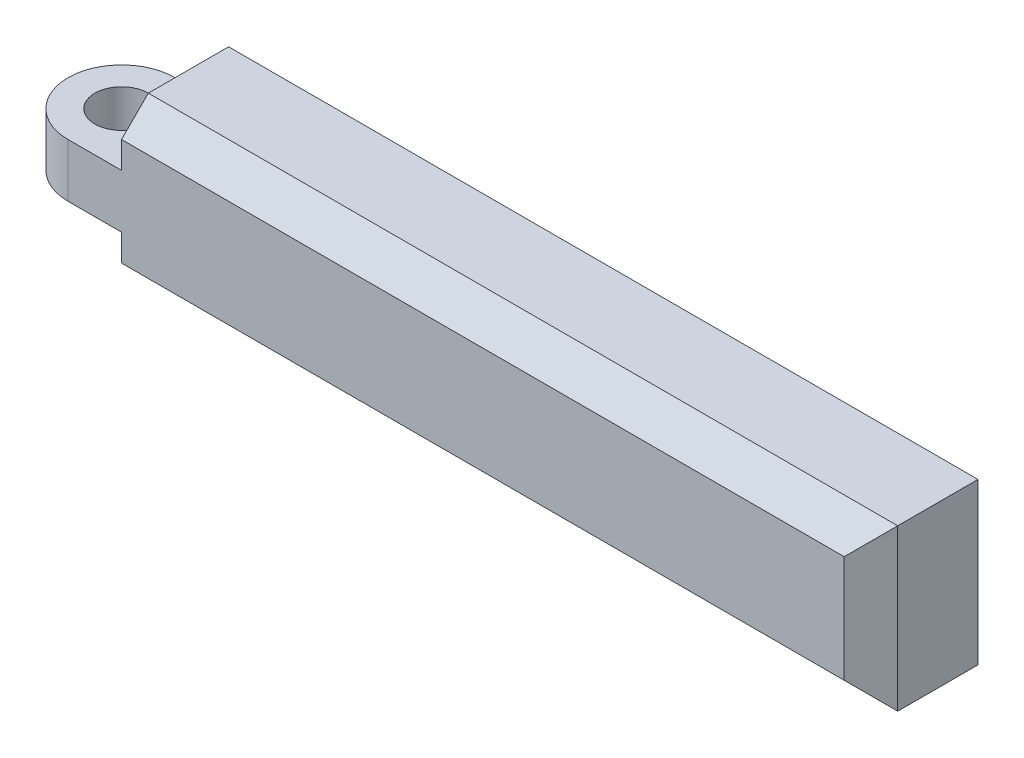
ISO-10303-21;
HEADER;
FILE_DESCRIPTION(('STEP AP214'),'2;1');
FILE_NAME('part.step','',(''),(''),'','','');
FILE_SCHEMA(('AUTOMOTIVE_DESIGN { 1 0 10303 214 1 1 1 1 }'));
ENDSEC;
DATA;
#1=APPLICATION_CONTEXT('core data for automotive mechanical design processes');
#2=APPLICATION_PROTOCOL_DEFINITION('international standard','automotive_design',2000,#1);
#3=PRODUCT_CONTEXT('',#1,'mechanical');
#4=PRODUCT('Part','Part','',(#3));
#5=PRODUCT_RELATED_PRODUCT_CATEGORY('part','',(#4));
#6=PRODUCT_DEFINITION_FORMATION('','',#4);
#7=PRODUCT_DEFINITION_CONTEXT('part definition',#1,'design');
#8=PRODUCT_DEFINITION('design','',#6,#7);
#9=PRODUCT_DEFINITION_SHAPE('','',#8);
#10=(LENGTH_UNIT() NAMED_UNIT(*) SI_UNIT(.MILLI.,.METRE.));
#11=(NAMED_UNIT(*) PLANE_ANGLE_UNIT() SI_UNIT($,.RADIAN.));
#12=(NAMED_UNIT(*) SI_UNIT($,.STERADIAN.) SOLID_ANGLE_UNIT());
#13=UNCERTAINTY_MEASURE_WITH_UNIT(LENGTH_MEASURE(1.E-05),#10,'distance_accuracy_value','');
#14=(GEOMETRIC_REPRESENTATION_CONTEXT(3) GLOBAL_UNCERTAINTY_ASSIGNED_CONTEXT((#13)) GLOBAL_UNIT_ASSIGNED_CONTEXT((#10,
#11,#12)) REPRESENTATION_CONTEXT('',''));
#15=CARTESIAN_POINT('',(0.,0.,0.));
#16=DIRECTION('',(0.,0.,1.));
#17=DIRECTION('',(1.,0.,0.));
#18=AXIS2_PLACEMENT_3D('',#15,#16,#17);
#19=CARTESIAN_POINT('',(-9.,2.,-1.));
#20=DIRECTION('',(0.,-1.,0.));
#21=DIRECTION('',(0.,0.,1.));
#22=AXIS2_PLACEMENT_3D('',#19,#20,#21);
#23=PLANE('',#22);
#24=CARTESIAN_POINT('',(-8.,2.,-2.));
#25=DIRECTION('',(0.,-1.,0.));
#26=DIRECTION('',(0.,0.,-1.));
#27=AXIS2_PLACEMENT_3D('',#24,#25,#26);
#28=CIRCLE('',#27,0.5);
#29=CARTESIAN_POINT('',(-8.,2.,-2.5));
#30=VERTEX_POINT('',#29);
#31=EDGE_CURVE('E156',#30,#30,#28,.T.);
#32=ORIENTED_EDGE('',*,*,#31,.T.);
#33=EDGE_LOOP('',(#32));
#34=FACE_BOUND('',#33,.T.);
#35=CARTESIAN_POINT('',(-8.,2.,-2.));
#36=DIRECTION('',(0.,-1.,0.));
#37=DIRECTION('',(0.,0.,-1.));
#38=AXIS2_PLACEMENT_3D('',#35,#36,#37);
#39=CIRCLE('',#38,1.);
#40=CARTESIAN_POINT('',(-8.,2.,-1.));
#41=VERTEX_POINT('',#40);
#42=CARTESIAN_POINT('',(-8.,2.,-3.));
#43=VERTEX_POINT('',#42);
#44=EDGE_CURVE('E147',#41,#43,#39,.T.);
#45=ORIENTED_EDGE('',*,*,#44,.F.);
#46=DIRECTION('',(1.,0.,0.));
#47=VECTOR('',#46,1.);
#48=CARTESIAN_POINT('',(-9.,2.,-1.));
#49=LINE('',#48,#47);
#50=CARTESIAN_POINT('',(-7.,2.,-1.));
#51=VERTEX_POINT('',#50);
#52=EDGE_CURVE('E150',#41,#51,#49,.T.);
#53=ORIENTED_EDGE('',*,*,#52,.T.);
#54=DIRECTION('',(0.,0.,1.));
#55=VECTOR('',#54,1.);
#56=CARTESIAN_POINT('',(-7.,2.,-1.));
#57=LINE('',#56,#55);
#58=CARTESIAN_POINT('',(-7.,2.,-3.));
#59=VERTEX_POINT('',#58);
#60=EDGE_CURVE('E148',#59,#51,#57,.T.);
#61=ORIENTED_EDGE('',*,*,#60,.F.);
#62=DIRECTION('',(1.,0.,0.));
#63=VECTOR('',#62,1.);
#64=CARTESIAN_POINT('',(-9.,2.,-3.));
#65=LINE('',#64,#63);
#66=EDGE_CURVE('E136',#43,#59,#65,.T.);
#67=ORIENTED_EDGE('',*,*,#66,.F.);
#68=EDGE_LOOP('',(#45,#53,#61,#67));
#69=FACE_BOUND('',#68,.T.);
#70=ADVANCED_FACE('F58',(#34,#69),#23,.F.);
#71=CARTESIAN_POINT('',(-9.,1.,-1.));
#72=DIRECTION('',(0.,1.,0.));
#73=DIRECTION('',(0.,0.,-1.));
#74=AXIS2_PLACEMENT_3D('',#71,#72,#73);
#75=PLANE('',#74);
#76=CARTESIAN_POINT('',(-8.,1.,-2.));
#77=DIRECTION('',(0.,-1.,0.));
#78=DIRECTION('',(0.,0.,-1.));
#79=AXIS2_PLACEMENT_3D('',#76,#77,#78);
#80=CIRCLE('',#79,0.5);
#81=CARTESIAN_POINT('',(-8.,1.,-2.5));
#82=VERTEX_POINT('',#81);
#83=EDGE_CURVE('E163',#82,#82,#80,.T.);
#84=ORIENTED_EDGE('',*,*,#83,.F.);
#85=EDGE_LOOP('',(#84));
#86=FACE_BOUND('',#85,.T.);
#87=DIRECTION('',(1.,0.,0.));
#88=VECTOR('',#87,1.);
#89=CARTESIAN_POINT('',(-9.,1.,-3.));
#90=LINE('',#89,#88);
#91=CARTESIAN_POINT('',(-8.,1.,-3.));
#92=VERTEX_POINT('',#91);
#93=CARTESIAN_POINT('',(-7.,1.,-3.));
#94=VERTEX_POINT('',#93);
#95=EDGE_CURVE('E139',#92,#94,#90,.T.);
#96=ORIENTED_EDGE('',*,*,#95,.T.);
#97=DIRECTION('',(0.,0.,-1.));
#98=VECTOR('',#97,1.);
#99=CARTESIAN_POINT('',(-7.,1.,-1.));
#100=LINE('',#99,#98);
#101=CARTESIAN_POINT('',(-7.,1.,-1.));
#102=VERTEX_POINT('',#101);
#103=EDGE_CURVE('E165',#102,#94,#100,.T.);
#104=ORIENTED_EDGE('',*,*,#103,.F.);
#105=DIRECTION('',(1.,0.,0.));
#106=VECTOR('',#105,1.);
#107=CARTESIAN_POINT('',(-9.,1.,-1.));
#108=LINE('',#107,#106);
#109=CARTESIAN_POINT('',(-8.,1.,-1.));
#110=VERTEX_POINT('',#109);
#111=EDGE_CURVE('E168',#110,#102,#108,.T.);
#112=ORIENTED_EDGE('',*,*,#111,.F.);
#113=CARTESIAN_POINT('',(-8.,1.,-2.));
#114=DIRECTION('',(0.,-1.,0.));
#115=DIRECTION('',(0.,0.,-1.));
#116=AXIS2_PLACEMENT_3D('',#113,#114,#115);
#117=CIRCLE('',#116,1.);
#118=EDGE_CURVE('E161',#110,#92,#117,.T.);
#119=ORIENTED_EDGE('',*,*,#118,.T.);
#120=EDGE_LOOP('',(#96,#104,#112,#119));
#121=FACE_BOUND('',#120,.T.);
#122=ADVANCED_FACE('F223',(#86,#121),#75,.F.);
#123=CARTESIAN_POINT('',(-7.,3.,-3.));
#124=DIRECTION('',(0.,0.,1.));
#125=DIRECTION('',(-1.,0.,0.));
#126=AXIS2_PLACEMENT_3D('',#123,#124,#125);
#127=PLANE('',#126);
#128=DIRECTION('',(0.,1.,0.));
#129=VECTOR('',#128,1.);
#130=CARTESIAN_POINT('',(-8.,0.,-3.));
#131=LINE('',#130,#129);
#132=EDGE_CURVE('E12',#92,#43,#131,.T.);
#133=ORIENTED_EDGE('',*,*,#132,.T.);
#134=ORIENTED_EDGE('',*,*,#66,.T.);
#135=DIRECTION('',(0.,-1.,0.));
#136=VECTOR('',#135,1.);
#137=CARTESIAN_POINT('',(-7.,3.,-3.));
#138=LINE('',#137,#136);
#139=CARTESIAN_POINT('',(-7.,3.,-3.));
#140=VERTEX_POINT('',#139);
#141=EDGE_CURVE('E81',#140,#59,#138,.T.);
#142=ORIENTED_EDGE('',*,*,#141,.F.);
#143=DIRECTION('',(1.,0.,0.));
#144=VECTOR('',#143,1.);
#145=CARTESIAN_POINT('',(-7.,3.,-3.));
#146=LINE('',#145,#144);
#147=CARTESIAN_POINT('',(7.,3.,-3.));
#148=VERTEX_POINT('',#147);
#149=EDGE_CURVE('E178',#140,#148,#146,.T.);
#150=ORIENTED_EDGE('',*,*,#149,.T.);
#151=DIRECTION('',(0.,-1.,0.));
#152=VECTOR('',#151,1.);
#153=CARTESIAN_POINT('',(7.,3.,-3.));
#154=LINE('',#153,#152);
#155=CARTESIAN_POINT('',(7.,0.,-3.));
#156=VERTEX_POINT('',#155);
#157=EDGE_CURVE('E181',#148,#156,#154,.T.);
#158=ORIENTED_EDGE('',*,*,#157,.T.);
#159=DIRECTION('',(1.,0.,0.));
#160=VECTOR('',#159,1.);
#161=CARTESIAN_POINT('',(-7.,0.,-3.));
#162=LINE('',#161,#160);
#163=CARTESIAN_POINT('',(-7.,0.,-3.));
#164=VERTEX_POINT('',#163);
#165=EDGE_CURVE('E176',#164,#156,#162,.T.);
#166=ORIENTED_EDGE('',*,*,#165,.F.);
#167=EDGE_CURVE('E73',#94,#164,#138,.T.);
#168=ORIENTED_EDGE('',*,*,#167,.F.);
#169=ORIENTED_EDGE('',*,*,#95,.F.);
#170=EDGE_LOOP('',(#133,#134,#142,#150,#158,#166,#168,#169));
#171=FACE_BOUND('',#170,.T.);
#172=ADVANCED_FACE('F135',(#171),#127,.F.);
#173=CARTESIAN_POINT('',(-7.,3.,-1.));
#174=DIRECTION('',(1.,0.,0.));
#175=DIRECTION('',(0.,0.,1.));
#176=AXIS2_PLACEMENT_3D('',#173,#174,#175);
#177=PLANE('',#176);
#178=ORIENTED_EDGE('',*,*,#103,.T.);
#179=ORIENTED_EDGE('',*,*,#167,.T.);
#180=DIRECTION('',(0.,0.,-1.));
#181=VECTOR('',#180,1.);
#182=CARTESIAN_POINT('',(-7.,0.,-1.));
#183=LINE('',#182,#181);
#184=CARTESIAN_POINT('',(-7.,0.,-1.5));
#185=VERTEX_POINT('',#184);
#186=EDGE_CURVE('E185',#185,#164,#183,.T.);
#187=ORIENTED_EDGE('',*,*,#186,.F.);
#188=DIRECTION('',(0.,0.707106781186549,0.707106781186546));
#189=VECTOR('',#188,1.);
#190=CARTESIAN_POINT('',(-7.,0.5,-1.));
#191=LINE('',#190,#189);
#192=CARTESIAN_POINT('',(-7.,0.5,-1.));
#193=VERTEX_POINT('',#192);
#194=EDGE_CURVE('E207',#193,#185,#191,.F.);
#195=ORIENTED_EDGE('',*,*,#194,.F.);
#196=DIRECTION('',(0.,-1.,0.));
#197=VECTOR('',#196,1.);
#198=CARTESIAN_POINT('',(-7.,3.,-1.));
#199=LINE('',#198,#197);
#200=EDGE_CURVE('E193',#102,#193,#199,.T.);
#201=ORIENTED_EDGE('',*,*,#200,.F.);
#202=EDGE_LOOP('',(#178,#179,#187,#195,#201));
#203=FACE_BOUND('',#202,.T.);
#204=ADVANCED_FACE('F240',(#203),#177,.F.);
#205=ORIENTED_EDGE('',*,*,#60,.T.);
#206=CARTESIAN_POINT('',(-7.,2.5,-1.));
#207=VERTEX_POINT('',#206);
#208=EDGE_CURVE('E194',#207,#51,#199,.T.);
#209=ORIENTED_EDGE('',*,*,#208,.F.);
#210=DIRECTION('',(0.,-0.707106781186549,0.707106781186546));
#211=VECTOR('',#210,1.);
#212=CARTESIAN_POINT('',(-7.,3.,-1.5));
#213=LINE('',#212,#211);
#214=CARTESIAN_POINT('',(-7.,3.,-1.5));
#215=VERTEX_POINT('',#214);
#216=EDGE_CURVE('E204',#215,#207,#213,.T.);
#217=ORIENTED_EDGE('',*,*,#216,.F.);
#218=DIRECTION('',(0.,0.,-1.));
#219=VECTOR('',#218,1.);
#220=CARTESIAN_POINT('',(-7.,3.,-1.));
#221=LINE('',#220,#219);
#222=EDGE_CURVE('E175',#215,#140,#221,.T.);
#223=ORIENTED_EDGE('',*,*,#222,.T.);
#224=ORIENTED_EDGE('',*,*,#141,.T.);
#225=EDGE_LOOP('',(#205,#209,#217,#223,#224));
#226=FACE_BOUND('',#225,.T.);
#227=ADVANCED_FACE('F237',(#226),#177,.F.);
#228=CARTESIAN_POINT('',(7.,3.,-1.));
#229=DIRECTION('',(-1.,0.,0.));
#230=DIRECTION('',(0.,0.,-1.));
#231=AXIS2_PLACEMENT_3D('',#228,#229,#230);
#232=PLANE('',#231);
#233=DIRECTION('',(0.,0.,1.));
#234=VECTOR('',#233,1.);
#235=CARTESIAN_POINT('',(7.,0.,-1.));
#236=LINE('',#235,#234);
#237=CARTESIAN_POINT('',(7.,0.,-1.5));
#238=VERTEX_POINT('',#237);
#239=EDGE_CURVE('E182',#156,#238,#236,.T.);
#240=ORIENTED_EDGE('',*,*,#239,.F.);
#241=ORIENTED_EDGE('',*,*,#157,.F.);
#242=DIRECTION('',(0.,0.,1.));
#243=VECTOR('',#242,1.);
#244=CARTESIAN_POINT('',(7.,3.,-1.));
#245=LINE('',#244,#243);
#246=CARTESIAN_POINT('',(7.,3.,-1.5));
#247=VERTEX_POINT('',#246);
#248=EDGE_CURVE('E172',#148,#247,#245,.T.);
#249=ORIENTED_EDGE('',*,*,#248,.T.);
#250=DIRECTION('',(0.,1.,0.));
#251=VECTOR('',#250,1.);
#252=CARTESIAN_POINT('',(7.,3.,-1.5));
#253=LINE('',#252,#251);
#254=EDGE_CURVE('E213',#238,#247,#253,.T.);
#255=ORIENTED_EDGE('',*,*,#254,.F.);
#256=EDGE_LOOP('',(#240,#241,#249,#255));
#257=FACE_BOUND('',#256,.T.);
#258=ADVANCED_FACE('F239',(#257),#232,.F.);
#259=CARTESIAN_POINT('',(-7.,3.,-1.));
#260=DIRECTION('',(0.,0.,-1.));
#261=DIRECTION('',(1.,0.,0.));
#262=AXIS2_PLACEMENT_3D('',#259,#260,#261);
#263=PLANE('',#262);
#264=ORIENTED_EDGE('',*,*,#111,.T.);
#265=ORIENTED_EDGE('',*,*,#200,.T.);
#266=DIRECTION('',(-1.,0.,0.));
#267=VECTOR('',#266,1.);
#268=CARTESIAN_POINT('',(-7.,0.5,-1.));
#269=LINE('',#268,#267);
#270=CARTESIAN_POINT('',(6.5,0.5,-1.));
#271=VERTEX_POINT('',#270);
#272=EDGE_CURVE('E202',#271,#193,#269,.T.);
#273=ORIENTED_EDGE('',*,*,#272,.F.);
#274=DIRECTION('',(0.,-1.,0.));
#275=VECTOR('',#274,1.);
#276=CARTESIAN_POINT('',(6.5,3.,-1.));
#277=LINE('',#276,#275);
#278=CARTESIAN_POINT('',(6.5,2.5,-1.));
#279=VERTEX_POINT('',#278);
#280=EDGE_CURVE('E199',#279,#271,#277,.T.);
#281=ORIENTED_EDGE('',*,*,#280,.F.);
#282=DIRECTION('',(1.,0.,0.));
#283=VECTOR('',#282,1.);
#284=CARTESIAN_POINT('',(7.,2.5,-1.));
#285=LINE('',#284,#283);
#286=EDGE_CURVE('E196',#207,#279,#285,.T.);
#287=ORIENTED_EDGE('',*,*,#286,.F.);
#288=ORIENTED_EDGE('',*,*,#208,.T.);
#289=ORIENTED_EDGE('',*,*,#52,.F.);
#290=DIRECTION('',(0.,1.,0.));
#291=VECTOR('',#290,1.);
#292=CARTESIAN_POINT('',(-8.,0.,-1.));
#293=LINE('',#292,#291);
#294=EDGE_CURVE('E153',#110,#41,#293,.T.);
#295=ORIENTED_EDGE('',*,*,#294,.F.);
#296=EDGE_LOOP('',(#264,#265,#273,#281,#287,#288,#289,#295));
#297=FACE_BOUND('',#296,.T.);
#298=ADVANCED_FACE('F231',(#297),#263,.F.);
#299=CARTESIAN_POINT('',(0.,3.,-2.));
#300=DIRECTION('',(0.,1.,0.));
#301=DIRECTION('',(0.,0.,-1.));
#302=AXIS2_PLACEMENT_3D('',#299,#300,#301);
#303=PLANE('',#302);
#304=ORIENTED_EDGE('',*,*,#248,.F.);
#305=ORIENTED_EDGE('',*,*,#149,.F.);
#306=ORIENTED_EDGE('',*,*,#222,.F.);
#307=DIRECTION('',(-1.,0.,0.));
#308=VECTOR('',#307,1.);
#309=CARTESIAN_POINT('',(-7.,3.,-1.5));
#310=LINE('',#309,#308);
#311=EDGE_CURVE('E66',#247,#215,#310,.T.);
#312=ORIENTED_EDGE('',*,*,#311,.F.);
#313=EDGE_LOOP('',(#304,#305,#306,#312));
#314=FACE_BOUND('',#313,.T.);
#315=ADVANCED_FACE('F258',(#314),#303,.T.);
#316=CARTESIAN_POINT('',(0.,0.,-2.));
#317=DIRECTION('',(0.,1.,0.));
#318=DIRECTION('',(0.,0.,-1.));
#319=AXIS2_PLACEMENT_3D('',#316,#317,#318);
#320=PLANE('',#319);
#321=ORIENTED_EDGE('',*,*,#186,.T.);
#322=ORIENTED_EDGE('',*,*,#165,.T.);
#323=ORIENTED_EDGE('',*,*,#239,.T.);
#324=DIRECTION('',(1.,0.,0.));
#325=VECTOR('',#324,1.);
#326=CARTESIAN_POINT('',(0.,0.,-1.5));
#327=LINE('',#326,#325);
#328=EDGE_CURVE('E210',#185,#238,#327,.T.);
#329=ORIENTED_EDGE('',*,*,#328,.F.);
#330=EDGE_LOOP('',(#321,#322,#323,#329));
#331=FACE_BOUND('',#330,.T.);
#332=ADVANCED_FACE('F261',(#331),#320,.F.);
#333=CARTESIAN_POINT('',(0.,3.,-1.5));
#334=DIRECTION('',(0.,0.707106781186546,0.707106781186549));
#335=DIRECTION('',(1.,0.,0.));
#336=AXIS2_PLACEMENT_3D('',#333,#334,#335);
#337=PLANE('',#336);
#338=ORIENTED_EDGE('',*,*,#216,.T.);
#339=ORIENTED_EDGE('',*,*,#286,.T.);
#340=DIRECTION('',(0.577350269189626,0.577350269189627,-0.577350269189625));
#341=VECTOR('',#340,1.);
#342=CARTESIAN_POINT('',(4.66666666666667,0.66666666666666,0.833333333333332));
#343=LINE('',#342,#341);
#344=EDGE_CURVE('E186',#279,#247,#343,.T.);
#345=ORIENTED_EDGE('',*,*,#344,.T.);
#346=ORIENTED_EDGE('',*,*,#311,.T.);
#347=EDGE_LOOP('',(#338,#339,#345,#346));
#348=FACE_BOUND('',#347,.T.);
#349=ADVANCED_FACE('F60',(#348),#337,.T.);
#350=CARTESIAN_POINT('',(6.5,3.,-1.));
#351=DIRECTION('',(-0.707106781186546,0.,-0.707106781186549));
#352=DIRECTION('',(0.,-1.,0.));
#353=AXIS2_PLACEMENT_3D('',#350,#351,#352);
#354=PLANE('',#353);
#355=ORIENTED_EDGE('',*,*,#344,.F.);
#356=ORIENTED_EDGE('',*,*,#280,.T.);
#357=DIRECTION('',(-0.577350269189626,0.577350269189627,0.577350269189625));
#358=VECTOR('',#357,1.);
#359=CARTESIAN_POINT('',(5.66666666666667,1.33333333333334,-0.166666666666669));
#360=LINE('',#359,#358);
#361=EDGE_CURVE('E149',#271,#238,#360,.F.);
#362=ORIENTED_EDGE('',*,*,#361,.T.);
#363=ORIENTED_EDGE('',*,*,#254,.T.);
#364=EDGE_LOOP('',(#355,#356,#362,#363));
#365=FACE_BOUND('',#364,.T.);
#366=ADVANCED_FACE('F313',(#365),#354,.F.);
#367=CARTESIAN_POINT('',(-7.,0.5,-1.));
#368=DIRECTION('',(0.,0.707106781186546,-0.707106781186549));
#369=DIRECTION('',(-1.,0.,0.));
#370=AXIS2_PLACEMENT_3D('',#367,#368,#369);
#371=PLANE('',#370);
#372=ORIENTED_EDGE('',*,*,#361,.F.);
#373=ORIENTED_EDGE('',*,*,#272,.T.);
#374=ORIENTED_EDGE('',*,*,#194,.T.);
#375=ORIENTED_EDGE('',*,*,#328,.T.);
#376=EDGE_LOOP('',(#372,#373,#374,#375));
#377=FACE_BOUND('',#376,.T.);
#378=ADVANCED_FACE('F322',(#377),#371,.F.);
#379=CARTESIAN_POINT('',(-8.,0.,-2.));
#380=DIRECTION('',(0.,1.,0.));
#381=DIRECTION('',(0.,0.,-1.));
#382=AXIS2_PLACEMENT_3D('',#379,#380,#381);
#383=CYLINDRICAL_SURFACE('',#382,1.);
#384=ORIENTED_EDGE('',*,*,#118,.F.);
#385=ORIENTED_EDGE('',*,*,#294,.T.);
#386=ORIENTED_EDGE('',*,*,#44,.T.);
#387=ORIENTED_EDGE('',*,*,#132,.F.);
#388=EDGE_LOOP('',(#384,#385,#386,#387));
#389=FACE_BOUND('',#388,.T.);
#390=ADVANCED_FACE('F152',(#389),#383,.T.);
#391=CARTESIAN_POINT('',(-8.,0.,-2.));
#392=DIRECTION('',(0.,1.,0.));
#393=DIRECTION('',(0.,0.,-1.));
#394=AXIS2_PLACEMENT_3D('',#391,#392,#393);
#395=CYLINDRICAL_SURFACE('',#394,0.5);
#396=ORIENTED_EDGE('',*,*,#31,.F.);
#397=EDGE_LOOP('',(#396));
#398=FACE_BOUND('',#397,.T.);
#399=ORIENTED_EDGE('',*,*,#83,.T.);
#400=EDGE_LOOP('',(#399));
#401=FACE_BOUND('',#400,.T.);
#402=ADVANCED_FACE('F221',(#398,#401),#395,.F.);
#403=CLOSED_SHELL('',(#70,#122,#172,#204,#227,#258,#298,#315,#332,#349,#366,#378,#390,#402));
#404=MANIFOLD_SOLID_BREP('B2',#403);
#405=ADVANCED_BREP_SHAPE_REPRESENTATION('',(#18,#404),#14);
#406=SHAPE_DEFINITION_REPRESENTATION(#9,#405);
ENDSEC;
END-ISO-10303-21;
